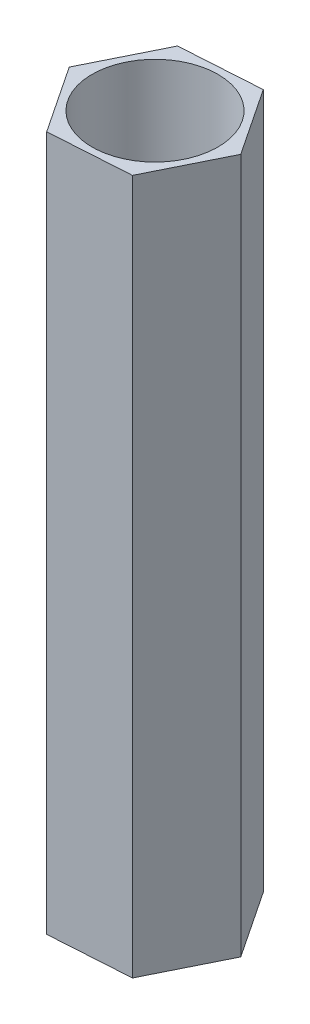
ISO-10303-21;
HEADER;
FILE_DESCRIPTION(('STEP AP214'),'2;1');
FILE_NAME('part.step','',(''),(''),'','','');
FILE_SCHEMA(('AUTOMOTIVE_DESIGN { 1 0 10303 214 1 1 1 1 }'));
ENDSEC;
DATA;
#1=APPLICATION_CONTEXT('core data for automotive mechanical design processes');
#2=APPLICATION_PROTOCOL_DEFINITION('international standard','automotive_design',2000,#1);
#3=PRODUCT_CONTEXT('',#1,'mechanical');
#4=PRODUCT('Part','Part','',(#3));
#5=PRODUCT_RELATED_PRODUCT_CATEGORY('part','',(#4));
#6=PRODUCT_DEFINITION_FORMATION('','',#4);
#7=PRODUCT_DEFINITION_CONTEXT('part definition',#1,'design');
#8=PRODUCT_DEFINITION('design','',#6,#7);
#9=PRODUCT_DEFINITION_SHAPE('','',#8);
#10=(LENGTH_UNIT() NAMED_UNIT(*) SI_UNIT(.MILLI.,.METRE.));
#11=(NAMED_UNIT(*) PLANE_ANGLE_UNIT() SI_UNIT($,.RADIAN.));
#12=(NAMED_UNIT(*) SI_UNIT($,.STERADIAN.) SOLID_ANGLE_UNIT());
#13=UNCERTAINTY_MEASURE_WITH_UNIT(LENGTH_MEASURE(1.E-05),#10,'distance_accuracy_value','');
#14=(GEOMETRIC_REPRESENTATION_CONTEXT(3) GLOBAL_UNCERTAINTY_ASSIGNED_CONTEXT((#13)) GLOBAL_UNIT_ASSIGNED_CONTEXT((#10,
#11,#12)) REPRESENTATION_CONTEXT('',''));
#15=CARTESIAN_POINT('',(0.,0.,0.));
#16=DIRECTION('',(0.,0.,1.));
#17=DIRECTION('',(1.,0.,0.));
#18=AXIS2_PLACEMENT_3D('',#15,#16,#17);
#19=CARTESIAN_POINT('',(0.,24.83,0.));
#20=DIRECTION('',(0.,1.,0.));
#21=DIRECTION('',(0.,0.,1.));
#22=AXIS2_PLACEMENT_3D('',#19,#20,#21);
#23=PLANE('',#22);
#24=DIRECTION('',(0.997993050136404,0.,-0.0633235491696111));
#25=VECTOR('',#24,1.);
#26=CARTESIAN_POINT('',(-1.28217001744005,24.83,2.5863822957388));
#27=LINE('',#26,#25);
#28=CARTESIAN_POINT('',(-1.28217001744005,24.83,2.5863822957388));
#29=VERTEX_POINT('',#28);
#30=CARTESIAN_POINT('',(1.5987877632881,24.83,2.40358295494322));
#31=VERTEX_POINT('',#30);
#32=EDGE_CURVE('E129',#29,#31,#27,.T.);
#33=ORIENTED_EDGE('',*,*,#32,.T.);
#34=DIRECTION('',(0.444156722829526,0.,-0.895949108803249));
#35=VECTOR('',#34,1.);
#36=CARTESIAN_POINT('',(1.5987877632881,24.83,2.40358295494322));
#37=LINE('',#36,#35);
#38=CARTESIAN_POINT('',(2.88095778072814,24.83,-0.182799340795588));
#39=VERTEX_POINT('',#38);
#40=EDGE_CURVE('E87',#31,#39,#37,.T.);
#41=ORIENTED_EDGE('',*,*,#40,.T.);
#42=DIRECTION('',(-0.553836327306878,0.,-0.832625559633638));
#43=VECTOR('',#42,1.);
#44=CARTESIAN_POINT('',(2.88095778072814,24.83,-0.182799340795588));
#45=LINE('',#44,#43);
#46=CARTESIAN_POINT('',(1.28217001744004,24.83,-2.58638229573881));
#47=VERTEX_POINT('',#46);
#48=EDGE_CURVE('E100',#39,#47,#45,.T.);
#49=ORIENTED_EDGE('',*,*,#48,.T.);
#50=DIRECTION('',(-0.997993050136404,0.,0.063323549169611));
#51=VECTOR('',#50,1.);
#52=CARTESIAN_POINT('',(1.28217001744004,24.83,-2.58638229573881));
#53=LINE('',#52,#51);
#54=CARTESIAN_POINT('',(-1.5987877632881,24.83,-2.40358295494322));
#55=VERTEX_POINT('',#54);
#56=EDGE_CURVE('E94',#47,#55,#53,.T.);
#57=ORIENTED_EDGE('',*,*,#56,.T.);
#58=DIRECTION('',(-0.444156722829526,0.,0.895949108803249));
#59=VECTOR('',#58,1.);
#60=CARTESIAN_POINT('',(-1.5987877632881,24.83,-2.40358295494322));
#61=LINE('',#60,#59);
#62=CARTESIAN_POINT('',(-2.88095778072814,24.83,0.182799340795587));
#63=VERTEX_POINT('',#62);
#64=EDGE_CURVE('E98',#55,#63,#61,.T.);
#65=ORIENTED_EDGE('',*,*,#64,.T.);
#66=DIRECTION('',(0.553836327306878,0.,0.832625559633638));
#67=VECTOR('',#66,1.);
#68=CARTESIAN_POINT('',(-2.88095778072814,24.83,0.182799340795587));
#69=LINE('',#68,#67);
#70=EDGE_CURVE('E50',#63,#29,#69,.T.);
#71=ORIENTED_EDGE('',*,*,#70,.T.);
#72=EDGE_LOOP('',(#33,#41,#49,#57,#65,#71));
#73=FACE_BOUND('',#72,.T.);
#74=CARTESIAN_POINT('',(0.,24.83,0.));
#75=DIRECTION('',(0.,1.,0.));
#76=DIRECTION('',(0.,0.,1.));
#77=AXIS2_PLACEMENT_3D('',#74,#75,#76);
#78=CIRCLE('',#77,2.25);
#79=CARTESIAN_POINT('',(0.,24.83,-2.25));
#80=VERTEX_POINT('',#79);
#81=EDGE_CURVE('E122',#80,#80,#78,.T.);
#82=ORIENTED_EDGE('',*,*,#81,.F.);
#83=EDGE_LOOP('',(#82));
#84=FACE_BOUND('',#83,.T.);
#85=ADVANCED_FACE('F33',(#73,#84),#23,.T.);
#86=CARTESIAN_POINT('',(0.,0.,0.));
#87=DIRECTION('',(0.,1.,0.));
#88=DIRECTION('',(0.,0.,1.));
#89=AXIS2_PLACEMENT_3D('',#86,#87,#88);
#90=PLANE('',#89);
#91=DIRECTION('',(0.997993050136404,0.,-0.0633235491696111));
#92=VECTOR('',#91,1.);
#93=CARTESIAN_POINT('',(-1.28217001744005,0.,2.5863822957388));
#94=LINE('',#93,#92);
#95=CARTESIAN_POINT('',(-1.28217001744005,0.,2.5863822957388));
#96=VERTEX_POINT('',#95);
#97=CARTESIAN_POINT('',(1.5987877632881,0.,2.40358295494322));
#98=VERTEX_POINT('',#97);
#99=EDGE_CURVE('E118',#96,#98,#94,.T.);
#100=ORIENTED_EDGE('',*,*,#99,.F.);
#101=DIRECTION('',(0.553836327306878,0.,0.832625559633638));
#102=VECTOR('',#101,1.);
#103=CARTESIAN_POINT('',(-2.88095778072814,0.,0.182799340795587));
#104=LINE('',#103,#102);
#105=CARTESIAN_POINT('',(-2.88095778072814,0.,0.182799340795587));
#106=VERTEX_POINT('',#105);
#107=EDGE_CURVE('E79',#106,#96,#104,.T.);
#108=ORIENTED_EDGE('',*,*,#107,.F.);
#109=DIRECTION('',(-0.444156722829526,0.,0.895949108803249));
#110=VECTOR('',#109,1.);
#111=CARTESIAN_POINT('',(-1.5987877632881,0.,-2.40358295494322));
#112=LINE('',#111,#110);
#113=CARTESIAN_POINT('',(-1.5987877632881,0.,-2.40358295494322));
#114=VERTEX_POINT('',#113);
#115=EDGE_CURVE('E73',#114,#106,#112,.T.);
#116=ORIENTED_EDGE('',*,*,#115,.F.);
#117=DIRECTION('',(-0.997993050136404,0.,0.063323549169611));
#118=VECTOR('',#117,1.);
#119=CARTESIAN_POINT('',(1.28217001744004,0.,-2.58638229573881));
#120=LINE('',#119,#118);
#121=CARTESIAN_POINT('',(1.28217001744004,0.,-2.58638229573881));
#122=VERTEX_POINT('',#121);
#123=EDGE_CURVE('E108',#122,#114,#120,.T.);
#124=ORIENTED_EDGE('',*,*,#123,.F.);
#125=DIRECTION('',(-0.553836327306878,0.,-0.832625559633638));
#126=VECTOR('',#125,1.);
#127=CARTESIAN_POINT('',(2.88095778072814,0.,-0.182799340795588));
#128=LINE('',#127,#126);
#129=CARTESIAN_POINT('',(2.88095778072814,0.,-0.182799340795588));
#130=VERTEX_POINT('',#129);
#131=EDGE_CURVE('E124',#130,#122,#128,.T.);
#132=ORIENTED_EDGE('',*,*,#131,.F.);
#133=DIRECTION('',(0.444156722829526,0.,-0.895949108803249));
#134=VECTOR('',#133,1.);
#135=CARTESIAN_POINT('',(1.5987877632881,0.,2.40358295494322));
#136=LINE('',#135,#134);
#137=EDGE_CURVE('E121',#98,#130,#136,.T.);
#138=ORIENTED_EDGE('',*,*,#137,.F.);
#139=EDGE_LOOP('',(#100,#108,#116,#124,#132,#138));
#140=FACE_BOUND('',#139,.T.);
#141=CARTESIAN_POINT('',(0.,0.,0.));
#142=DIRECTION('',(0.,1.,0.));
#143=DIRECTION('',(0.,0.,1.));
#144=AXIS2_PLACEMENT_3D('',#141,#142,#143);
#145=CIRCLE('',#144,2.25);
#146=CARTESIAN_POINT('',(0.,0.,-2.25));
#147=VERTEX_POINT('',#146);
#148=EDGE_CURVE('E222',#147,#147,#145,.T.);
#149=ORIENTED_EDGE('',*,*,#148,.T.);
#150=EDGE_LOOP('',(#149));
#151=FACE_BOUND('',#150,.T.);
#152=ADVANCED_FACE('F138',(#140,#151),#90,.F.);
#153=CARTESIAN_POINT('',(-1.28217001744005,24.83,2.5863822957388));
#154=DIRECTION('',(-0.0633235491696111,0.,-0.997993050136404));
#155=DIRECTION('',(-0.997993050136405,0.,0.0633235491696111));
#156=AXIS2_PLACEMENT_3D('',#153,#154,#155);
#157=PLANE('',#156);
#158=ORIENTED_EDGE('',*,*,#99,.T.);
#159=DIRECTION('',(0.,-1.,0.));
#160=VECTOR('',#159,1.);
#161=CARTESIAN_POINT('',(1.5987877632881,24.83,2.40358295494322));
#162=LINE('',#161,#160);
#163=EDGE_CURVE('E11',#31,#98,#162,.T.);
#164=ORIENTED_EDGE('',*,*,#163,.F.);
#165=ORIENTED_EDGE('',*,*,#32,.F.);
#166=DIRECTION('',(0.,-1.,0.));
#167=VECTOR('',#166,1.);
#168=CARTESIAN_POINT('',(-1.28217001744005,24.83,2.5863822957388));
#169=LINE('',#168,#167);
#170=EDGE_CURVE('E114',#29,#96,#169,.T.);
#171=ORIENTED_EDGE('',*,*,#170,.T.);
#172=EDGE_LOOP('',(#158,#164,#165,#171));
#173=FACE_BOUND('',#172,.T.);
#174=ADVANCED_FACE('F35',(#173),#157,.F.);
#175=CARTESIAN_POINT('',(1.5987877632881,24.83,2.40358295494322));
#176=DIRECTION('',(-0.895949108803249,0.,-0.444156722829526));
#177=DIRECTION('',(-0.444156722829526,0.,0.895949108803249));
#178=AXIS2_PLACEMENT_3D('',#175,#176,#177);
#179=PLANE('',#178);
#180=ORIENTED_EDGE('',*,*,#137,.T.);
#181=DIRECTION('',(0.,-1.,0.));
#182=VECTOR('',#181,1.);
#183=CARTESIAN_POINT('',(2.88095778072814,24.83,-0.182799340795588));
#184=LINE('',#183,#182);
#185=EDGE_CURVE('E42',#39,#130,#184,.T.);
#186=ORIENTED_EDGE('',*,*,#185,.F.);
#187=ORIENTED_EDGE('',*,*,#40,.F.);
#188=ORIENTED_EDGE('',*,*,#163,.T.);
#189=EDGE_LOOP('',(#180,#186,#187,#188));
#190=FACE_BOUND('',#189,.T.);
#191=ADVANCED_FACE('F163',(#190),#179,.F.);
#192=CARTESIAN_POINT('',(2.88095778072814,24.83,-0.182799340795588));
#193=DIRECTION('',(-0.832625559633638,0.,0.553836327306878));
#194=DIRECTION('',(0.553836327306878,0.,0.832625559633638));
#195=AXIS2_PLACEMENT_3D('',#192,#193,#194);
#196=PLANE('',#195);
#197=ORIENTED_EDGE('',*,*,#131,.T.);
#198=DIRECTION('',(0.,-1.,0.));
#199=VECTOR('',#198,1.);
#200=CARTESIAN_POINT('',(1.28217001744004,24.83,-2.58638229573881));
#201=LINE('',#200,#199);
#202=EDGE_CURVE('E109',#47,#122,#201,.T.);
#203=ORIENTED_EDGE('',*,*,#202,.F.);
#204=ORIENTED_EDGE('',*,*,#48,.F.);
#205=ORIENTED_EDGE('',*,*,#185,.T.);
#206=EDGE_LOOP('',(#197,#203,#204,#205));
#207=FACE_BOUND('',#206,.T.);
#208=ADVANCED_FACE('F135',(#207),#196,.F.);
#209=CARTESIAN_POINT('',(1.28217001744004,24.83,-2.58638229573881));
#210=DIRECTION('',(0.063323549169611,0.,0.997993050136404));
#211=DIRECTION('',(0.997993050136405,0.,-0.063323549169611));
#212=AXIS2_PLACEMENT_3D('',#209,#210,#211);
#213=PLANE('',#212);
#214=ORIENTED_EDGE('',*,*,#123,.T.);
#215=DIRECTION('',(0.,-1.,0.));
#216=VECTOR('',#215,1.);
#217=CARTESIAN_POINT('',(-1.5987877632881,24.83,-2.40358295494322));
#218=LINE('',#217,#216);
#219=EDGE_CURVE('E105',#55,#114,#218,.T.);
#220=ORIENTED_EDGE('',*,*,#219,.F.);
#221=ORIENTED_EDGE('',*,*,#56,.F.);
#222=ORIENTED_EDGE('',*,*,#202,.T.);
#223=EDGE_LOOP('',(#214,#220,#221,#222));
#224=FACE_BOUND('',#223,.T.);
#225=ADVANCED_FACE('F106',(#224),#213,.F.);
#226=CARTESIAN_POINT('',(-1.5987877632881,24.83,-2.40358295494322));
#227=DIRECTION('',(0.895949108803249,0.,0.444156722829526));
#228=DIRECTION('',(0.444156722829526,0.,-0.895949108803249));
#229=AXIS2_PLACEMENT_3D('',#226,#227,#228);
#230=PLANE('',#229);
#231=ORIENTED_EDGE('',*,*,#115,.T.);
#232=DIRECTION('',(0.,-1.,0.));
#233=VECTOR('',#232,1.);
#234=CARTESIAN_POINT('',(-2.88095778072814,24.83,0.182799340795587));
#235=LINE('',#234,#233);
#236=EDGE_CURVE('E110',#63,#106,#235,.T.);
#237=ORIENTED_EDGE('',*,*,#236,.F.);
#238=ORIENTED_EDGE('',*,*,#64,.F.);
#239=ORIENTED_EDGE('',*,*,#219,.T.);
#240=EDGE_LOOP('',(#231,#237,#238,#239));
#241=FACE_BOUND('',#240,.T.);
#242=ADVANCED_FACE('F112',(#241),#230,.F.);
#243=CARTESIAN_POINT('',(-2.88095778072814,24.83,0.182799340795587));
#244=DIRECTION('',(0.832625559633638,0.,-0.553836327306878));
#245=DIRECTION('',(-0.553836327306878,0.,-0.832625559633638));
#246=AXIS2_PLACEMENT_3D('',#243,#244,#245);
#247=PLANE('',#246);
#248=ORIENTED_EDGE('',*,*,#107,.T.);
#249=ORIENTED_EDGE('',*,*,#170,.F.);
#250=ORIENTED_EDGE('',*,*,#70,.F.);
#251=ORIENTED_EDGE('',*,*,#236,.T.);
#252=EDGE_LOOP('',(#248,#249,#250,#251));
#253=FACE_BOUND('',#252,.T.);
#254=ADVANCED_FACE('F143',(#253),#247,.F.);
#255=CARTESIAN_POINT('',(0.,24.83,0.));
#256=DIRECTION('',(0.,-1.,0.));
#257=DIRECTION('',(0.,0.,-1.));
#258=AXIS2_PLACEMENT_3D('',#255,#256,#257);
#259=CYLINDRICAL_SURFACE('',#258,2.25);
#260=CARTESIAN_POINT('',(0.,24.83,-2.25));
#261=CARTESIAN_POINT('',(0.,24.5713541666667,-2.25));
#262=CARTESIAN_POINT('',(0.,24.3127083333333,-2.25));
#263=CARTESIAN_POINT('',(0.,23.7954166666667,-2.25));
#264=CARTESIAN_POINT('',(0.,23.5367708333333,-2.25));
#265=CARTESIAN_POINT('',(0.,23.0194791666667,-2.25));
#266=CARTESIAN_POINT('',(0.,22.7608333333333,-2.25));
#267=CARTESIAN_POINT('',(0.,22.2435416666667,-2.25));
#268=CARTESIAN_POINT('',(0.,21.9848958333333,-2.25));
#269=CARTESIAN_POINT('',(0.,21.4676041666667,-2.25));
#270=CARTESIAN_POINT('',(0.,21.2089583333333,-2.25));
#271=CARTESIAN_POINT('',(0.,20.6916666666667,-2.25));
#272=CARTESIAN_POINT('',(0.,20.4330208333333,-2.25));
#273=CARTESIAN_POINT('',(0.,19.9157291666667,-2.25));
#274=CARTESIAN_POINT('',(0.,19.6570833333333,-2.25));
#275=CARTESIAN_POINT('',(0.,19.1397916666667,-2.25));
#276=CARTESIAN_POINT('',(0.,18.8811458333333,-2.25));
#277=CARTESIAN_POINT('',(0.,18.3638541666667,-2.25));
#278=CARTESIAN_POINT('',(0.,18.1052083333333,-2.25));
#279=CARTESIAN_POINT('',(0.,17.5879166666667,-2.25));
#280=CARTESIAN_POINT('',(0.,17.3292708333333,-2.25));
#281=CARTESIAN_POINT('',(0.,16.8119791666667,-2.25));
#282=CARTESIAN_POINT('',(0.,16.5533333333333,-2.25));
#283=CARTESIAN_POINT('',(0.,16.0360416666667,-2.25));
#284=CARTESIAN_POINT('',(0.,15.7773958333333,-2.25));
#285=CARTESIAN_POINT('',(0.,15.2601041666667,-2.25));
#286=CARTESIAN_POINT('',(0.,15.0014583333333,-2.25));
#287=CARTESIAN_POINT('',(0.,14.4841666666667,-2.25));
#288=CARTESIAN_POINT('',(0.,14.2255208333333,-2.25));
#289=CARTESIAN_POINT('',(0.,13.7082291666667,-2.25));
#290=CARTESIAN_POINT('',(0.,13.4495833333333,-2.25));
#291=CARTESIAN_POINT('',(0.,12.9322916666667,-2.25));
#292=CARTESIAN_POINT('',(0.,12.6736458333333,-2.25));
#293=CARTESIAN_POINT('',(0.,12.1563541666667,-2.25));
#294=CARTESIAN_POINT('',(0.,11.8977083333333,-2.25));
#295=CARTESIAN_POINT('',(0.,11.3804166666667,-2.25));
#296=CARTESIAN_POINT('',(0.,11.1217708333333,-2.25));
#297=CARTESIAN_POINT('',(0.,10.6044791666667,-2.25));
#298=CARTESIAN_POINT('',(0.,10.3458333333333,-2.25));
#299=CARTESIAN_POINT('',(0.,9.82854166666666,-2.25));
#300=CARTESIAN_POINT('',(0.,9.56989583333333,-2.25));
#301=CARTESIAN_POINT('',(0.,9.05260416666666,-2.25));
#302=CARTESIAN_POINT('',(0.,8.79395833333333,-2.25));
#303=CARTESIAN_POINT('',(0.,8.27666666666667,-2.25));
#304=CARTESIAN_POINT('',(0.,8.01802083333333,-2.25));
#305=CARTESIAN_POINT('',(0.,7.50072916666667,-2.25));
#306=CARTESIAN_POINT('',(0.,7.24208333333333,-2.25));
#307=CARTESIAN_POINT('',(0.,6.72479166666666,-2.25));
#308=CARTESIAN_POINT('',(0.,6.46614583333333,-2.25));
#309=CARTESIAN_POINT('',(0.,5.94885416666666,-2.25));
#310=CARTESIAN_POINT('',(0.,5.69020833333333,-2.25));
#311=CARTESIAN_POINT('',(0.,5.17291666666666,-2.25));
#312=CARTESIAN_POINT('',(0.,4.91427083333333,-2.25));
#313=CARTESIAN_POINT('',(0.,4.39697916666666,-2.25));
#314=CARTESIAN_POINT('',(0.,4.13833333333333,-2.25));
#315=CARTESIAN_POINT('',(0.,3.62104166666666,-2.25));
#316=CARTESIAN_POINT('',(0.,3.36239583333333,-2.25));
#317=CARTESIAN_POINT('',(0.,2.84510416666667,-2.25));
#318=CARTESIAN_POINT('',(0.,2.58645833333333,-2.25));
#319=CARTESIAN_POINT('',(0.,2.06916666666667,-2.25));
#320=CARTESIAN_POINT('',(0.,1.81052083333333,-2.25));
#321=CARTESIAN_POINT('',(0.,1.29322916666666,-2.25));
#322=CARTESIAN_POINT('',(0.,1.03458333333333,-2.25));
#323=CARTESIAN_POINT('',(0.,0.517291666666664,-2.25));
#324=CARTESIAN_POINT('',(0.,0.25864583333333,-2.25));
#325=CARTESIAN_POINT('',(0.,0.,-2.25));
#326=B_SPLINE_CURVE_WITH_KNOTS('',3,(#260,#261,#262,#263,#264,#265,#266,#267,#268,#269,#270,
#271,#272,#273,#274,#275,#276,#277,#278,#279,#280,#281,#282,#283,#284,#285,#286,#287,#288,#289,
#290,#291,#292,#293,#294,#295,#296,#297,#298,#299,#300,#301,#302,#303,#304,#305,#306,#307,#308,
#309,#310,#311,#312,#313,#314,#315,#316,#317,#318,#319,#320,#321,#322,#323,#324,#325),
.UNSPECIFIED.,.F.,.F.,(4,2,2,2,2,2,2,2,2,2,2,2,2,2,2,2,2,2,2,2,2,2,2,2,2,2,2,2,2,2,2,2,4),(0.,
0.775937500000001,1.551875,2.3278125,3.10375,3.8796875,4.655625,5.4315625,6.2075,6.9834375,
7.759375,8.5353125,9.31125,10.0871875,10.863125,11.6390625,12.415,13.1909375,13.966875,
14.7428125,15.51875,16.2946875,17.070625,17.8465625,18.6225,19.3984375,20.174375,20.9503125,
21.72625,22.5021875,23.278125,24.0540625,24.83),.UNSPECIFIED.);
#327=EDGE_CURVE('BSEAM145',#80,#147,#326,.T.);
#328=ORIENTED_EDGE('',*,*,#81,.T.);
#329=ORIENTED_EDGE('',*,*,#148,.F.);
#330=ORIENTED_EDGE('',*,*,#327,.T.);
#331=ORIENTED_EDGE('',*,*,#327,.F.);
#332=EDGE_LOOP('',(#328,#330,#329,#331));
#333=FACE_BOUND('',#332,.T.);
#334=ADVANCED_FACE('F145',(#333),#259,.F.);
#335=CLOSED_SHELL('',(#85,#152,#174,#191,#208,#225,#242,#254,#334));
#336=MANIFOLD_SOLID_BREP('B2',#335);
#337=ADVANCED_BREP_SHAPE_REPRESENTATION('',(#18,#336),#14);
#338=SHAPE_DEFINITION_REPRESENTATION(#9,#337);
ENDSEC;
END-ISO-10303-21;
